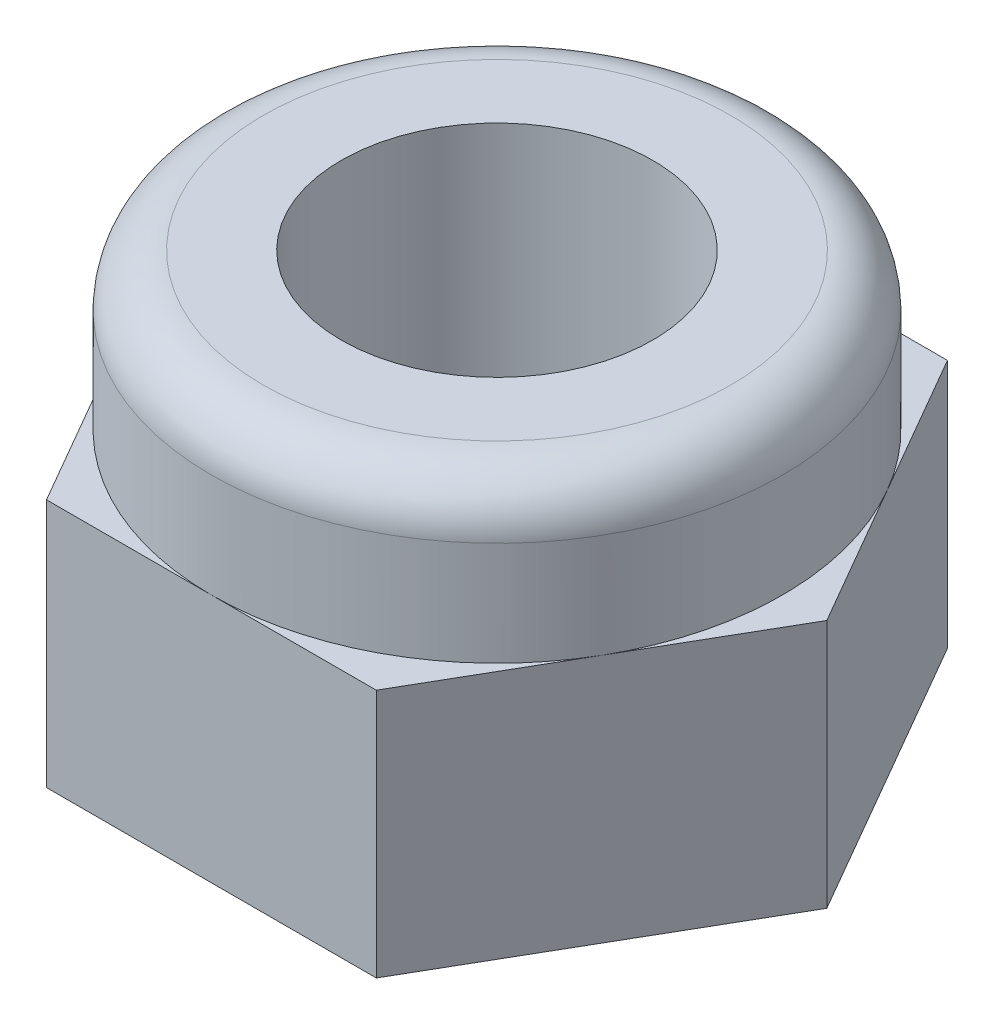
ISO-10303-21;
HEADER;
FILE_DESCRIPTION(('STEP AP214'),'2;1');
FILE_NAME('part.step','',(''),(''),'','','');
FILE_SCHEMA(('AUTOMOTIVE_DESIGN { 1 0 10303 214 1 1 1 1 }'));
ENDSEC;
DATA;
#1=APPLICATION_CONTEXT('core data for automotive mechanical design processes');
#2=APPLICATION_PROTOCOL_DEFINITION('international standard','automotive_design',2000,#1);
#3=PRODUCT_CONTEXT('',#1,'mechanical');
#4=PRODUCT('Part','Part','',(#3));
#5=PRODUCT_RELATED_PRODUCT_CATEGORY('part','',(#4));
#6=PRODUCT_DEFINITION_FORMATION('','',#4);
#7=PRODUCT_DEFINITION_CONTEXT('part definition',#1,'design');
#8=PRODUCT_DEFINITION('design','',#6,#7);
#9=PRODUCT_DEFINITION_SHAPE('','',#8);
#10=(LENGTH_UNIT() NAMED_UNIT(*) SI_UNIT(.MILLI.,.METRE.));
#11=(NAMED_UNIT(*) PLANE_ANGLE_UNIT() SI_UNIT($,.RADIAN.));
#12=(NAMED_UNIT(*) SI_UNIT($,.STERADIAN.) SOLID_ANGLE_UNIT());
#13=UNCERTAINTY_MEASURE_WITH_UNIT(LENGTH_MEASURE(1.E-05),#10,'distance_accuracy_value','');
#14=(GEOMETRIC_REPRESENTATION_CONTEXT(3) GLOBAL_UNCERTAINTY_ASSIGNED_CONTEXT((#13)) GLOBAL_UNIT_ASSIGNED_CONTEXT((#10,
#11,#12)) REPRESENTATION_CONTEXT('',''));
#15=CARTESIAN_POINT('',(0.,0.,0.));
#16=DIRECTION('',(0.,0.,1.));
#17=DIRECTION('',(1.,0.,0.));
#18=AXIS2_PLACEMENT_3D('',#15,#16,#17);
#19=CARTESIAN_POINT('',(0.,2.4,0.));
#20=DIRECTION('',(0.,1.,0.));
#21=DIRECTION('',(0.,0.,1.));
#22=AXIS2_PLACEMENT_3D('',#19,#20,#21);
#23=PLANE('',#22);
#24=CARTESIAN_POINT('',(0.,2.4,0.));
#25=DIRECTION('',(0.,1.,0.));
#26=DIRECTION('',(0.,0.,1.));
#27=AXIS2_PLACEMENT_3D('',#24,#25,#26);
#28=CIRCLE('',#27,2.75);
#29=CARTESIAN_POINT('',(0.,2.4,2.75));
#30=VERTEX_POINT('',#29);
#31=CARTESIAN_POINT('',(2.38156986040721,2.4,1.375));
#32=VERTEX_POINT('',#31);
#33=EDGE_CURVE('E130',#30,#32,#28,.T.);
#34=ORIENTED_EDGE('',*,*,#33,.F.);
#35=DIRECTION('',(1.,0.,0.));
#36=VECTOR('',#35,1.);
#37=CARTESIAN_POINT('',(-1.58771324027147,2.4,2.75));
#38=LINE('',#37,#36);
#39=CARTESIAN_POINT('',(1.58771324027147,2.4,2.75));
#40=VERTEX_POINT('',#39);
#41=EDGE_CURVE('E119',#30,#40,#38,.T.);
#42=ORIENTED_EDGE('',*,*,#41,.T.);
#43=DIRECTION('',(0.5,0.,-0.866025403784439));
#44=VECTOR('',#43,1.);
#45=CARTESIAN_POINT('',(1.58771324027147,2.4,2.75));
#46=LINE('',#45,#44);
#47=EDGE_CURVE('E131',#40,#32,#46,.T.);
#48=ORIENTED_EDGE('',*,*,#47,.T.);
#49=EDGE_LOOP('',(#34,#42,#48));
#50=FACE_BOUND('',#49,.T.);
#51=ADVANCED_FACE('F41',(#50),#23,.T.);
#52=CARTESIAN_POINT('',(2.38156986040721,2.4,-1.375));
#53=VERTEX_POINT('',#52);
#54=EDGE_CURVE('E137',#32,#53,#28,.T.);
#55=ORIENTED_EDGE('',*,*,#54,.F.);
#56=CARTESIAN_POINT('',(3.17542648054294,2.4,0.));
#57=VERTEX_POINT('',#56);
#58=EDGE_CURVE('E151',#32,#57,#46,.T.);
#59=ORIENTED_EDGE('',*,*,#58,.T.);
#60=DIRECTION('',(-0.5,0.,-0.866025403784439));
#61=VECTOR('',#60,1.);
#62=CARTESIAN_POINT('',(3.17542648054294,2.4,0.));
#63=LINE('',#62,#61);
#64=EDGE_CURVE('E152',#57,#53,#63,.T.);
#65=ORIENTED_EDGE('',*,*,#64,.T.);
#66=EDGE_LOOP('',(#55,#59,#65));
#67=FACE_BOUND('',#66,.T.);
#68=ADVANCED_FACE('F232',(#67),#23,.T.);
#69=CARTESIAN_POINT('',(0.,2.4,-2.75));
#70=VERTEX_POINT('',#69);
#71=EDGE_CURVE('E189',#53,#70,#28,.T.);
#72=ORIENTED_EDGE('',*,*,#71,.F.);
#73=CARTESIAN_POINT('',(1.58771324027147,2.4,-2.75));
#74=VERTEX_POINT('',#73);
#75=EDGE_CURVE('E150',#53,#74,#63,.T.);
#76=ORIENTED_EDGE('',*,*,#75,.T.);
#77=DIRECTION('',(-1.,0.,0.));
#78=VECTOR('',#77,1.);
#79=CARTESIAN_POINT('',(1.58771324027147,2.4,-2.75));
#80=LINE('',#79,#78);
#81=EDGE_CURVE('E156',#74,#70,#80,.T.);
#82=ORIENTED_EDGE('',*,*,#81,.T.);
#83=EDGE_LOOP('',(#72,#76,#82));
#84=FACE_BOUND('',#83,.T.);
#85=ADVANCED_FACE('F200',(#84),#23,.T.);
#86=CARTESIAN_POINT('',(-2.38156986040721,2.4,-1.375));
#87=VERTEX_POINT('',#86);
#88=EDGE_CURVE('E141',#70,#87,#28,.T.);
#89=ORIENTED_EDGE('',*,*,#88,.F.);
#90=CARTESIAN_POINT('',(-1.58771324027147,2.4,-2.75));
#91=VERTEX_POINT('',#90);
#92=EDGE_CURVE('E155',#70,#91,#80,.T.);
#93=ORIENTED_EDGE('',*,*,#92,.T.);
#94=DIRECTION('',(-0.5,0.,0.866025403784439));
#95=VECTOR('',#94,1.);
#96=CARTESIAN_POINT('',(-1.58771324027147,2.4,-2.75));
#97=LINE('',#96,#95);
#98=EDGE_CURVE('E160',#91,#87,#97,.T.);
#99=ORIENTED_EDGE('',*,*,#98,.T.);
#100=EDGE_LOOP('',(#89,#93,#99));
#101=FACE_BOUND('',#100,.T.);
#102=ADVANCED_FACE('F193',(#101),#23,.T.);
#103=CARTESIAN_POINT('',(-2.38156986040721,2.4,1.375));
#104=VERTEX_POINT('',#103);
#105=EDGE_CURVE('E64',#87,#104,#28,.T.);
#106=ORIENTED_EDGE('',*,*,#105,.F.);
#107=CARTESIAN_POINT('',(-3.17542648054294,2.4,0.));
#108=VERTEX_POINT('',#107);
#109=EDGE_CURVE('E159',#87,#108,#97,.T.);
#110=ORIENTED_EDGE('',*,*,#109,.T.);
#111=DIRECTION('',(0.5,0.,0.866025403784439));
#112=VECTOR('',#111,1.);
#113=CARTESIAN_POINT('',(-3.17542648054294,2.4,0.));
#114=LINE('',#113,#112);
#115=EDGE_CURVE('E128',#108,#104,#114,.T.);
#116=ORIENTED_EDGE('',*,*,#115,.T.);
#117=EDGE_LOOP('',(#106,#110,#116));
#118=FACE_BOUND('',#117,.T.);
#119=ADVANCED_FACE('F219',(#118),#23,.T.);
#120=CARTESIAN_POINT('',(1.58771324027147,2.4,2.75));
#121=DIRECTION('',(-0.866025403784439,0.,-0.5));
#122=DIRECTION('',(-0.5,0.,0.866025403784439));
#123=AXIS2_PLACEMENT_3D('',#120,#121,#122);
#124=PLANE('',#123);
#125=DIRECTION('',(0.5,0.,-0.866025403784439));
#126=VECTOR('',#125,1.);
#127=CARTESIAN_POINT('',(1.58771324027147,0.,2.75));
#128=LINE('',#127,#126);
#129=CARTESIAN_POINT('',(1.58771324027147,0.,2.75));
#130=VERTEX_POINT('',#129);
#131=CARTESIAN_POINT('',(3.17542648054294,0.,0.));
#132=VERTEX_POINT('',#131);
#133=EDGE_CURVE('E134',#130,#132,#128,.T.);
#134=ORIENTED_EDGE('',*,*,#133,.T.);
#135=DIRECTION('',(0.,-1.,0.));
#136=VECTOR('',#135,1.);
#137=CARTESIAN_POINT('',(3.17542648054294,2.4,0.));
#138=LINE('',#137,#136);
#139=EDGE_CURVE('E140',#57,#132,#138,.T.);
#140=ORIENTED_EDGE('',*,*,#139,.F.);
#141=ORIENTED_EDGE('',*,*,#58,.F.);
#142=ORIENTED_EDGE('',*,*,#47,.F.);
#143=DIRECTION('',(0.,-1.,0.));
#144=VECTOR('',#143,1.);
#145=CARTESIAN_POINT('',(1.58771324027147,2.4,2.75));
#146=LINE('',#145,#144);
#147=EDGE_CURVE('E118',#40,#130,#146,.T.);
#148=ORIENTED_EDGE('',*,*,#147,.T.);
#149=EDGE_LOOP('',(#134,#140,#141,#142,#148));
#150=FACE_BOUND('',#149,.T.);
#151=ADVANCED_FACE('F221',(#150),#124,.F.);
#152=CARTESIAN_POINT('',(3.17542648054294,2.4,0.));
#153=DIRECTION('',(-0.866025403784439,0.,0.5));
#154=DIRECTION('',(0.5,0.,0.866025403784439));
#155=AXIS2_PLACEMENT_3D('',#152,#153,#154);
#156=PLANE('',#155);
#157=DIRECTION('',(-0.5,0.,-0.866025403784439));
#158=VECTOR('',#157,1.);
#159=CARTESIAN_POINT('',(3.17542648054294,0.,0.));
#160=LINE('',#159,#158);
#161=CARTESIAN_POINT('',(1.58771324027147,0.,-2.75));
#162=VERTEX_POINT('',#161);
#163=EDGE_CURVE('E166',#132,#162,#160,.T.);
#164=ORIENTED_EDGE('',*,*,#163,.T.);
#165=DIRECTION('',(0.,-1.,0.));
#166=VECTOR('',#165,1.);
#167=CARTESIAN_POINT('',(1.58771324027147,2.4,-2.75));
#168=LINE('',#167,#166);
#169=EDGE_CURVE('E143',#74,#162,#168,.T.);
#170=ORIENTED_EDGE('',*,*,#169,.F.);
#171=ORIENTED_EDGE('',*,*,#75,.F.);
#172=ORIENTED_EDGE('',*,*,#64,.F.);
#173=ORIENTED_EDGE('',*,*,#139,.T.);
#174=EDGE_LOOP('',(#164,#170,#171,#172,#173));
#175=FACE_BOUND('',#174,.T.);
#176=ADVANCED_FACE('F205',(#175),#156,.F.);
#177=CARTESIAN_POINT('',(1.58771324027147,2.4,-2.75));
#178=DIRECTION('',(0.,0.,1.));
#179=DIRECTION('',(1.,0.,0.));
#180=AXIS2_PLACEMENT_3D('',#177,#178,#179);
#181=PLANE('',#180);
#182=DIRECTION('',(-1.,0.,0.));
#183=VECTOR('',#182,1.);
#184=CARTESIAN_POINT('',(1.58771324027147,0.,-2.75));
#185=LINE('',#184,#183);
#186=CARTESIAN_POINT('',(-1.58771324027147,0.,-2.75));
#187=VERTEX_POINT('',#186);
#188=EDGE_CURVE('E168',#162,#187,#185,.T.);
#189=ORIENTED_EDGE('',*,*,#188,.T.);
#190=DIRECTION('',(0.,-1.,0.));
#191=VECTOR('',#190,1.);
#192=CARTESIAN_POINT('',(-1.58771324027147,2.4,-2.75));
#193=LINE('',#192,#191);
#194=EDGE_CURVE('E182',#91,#187,#193,.T.);
#195=ORIENTED_EDGE('',*,*,#194,.F.);
#196=ORIENTED_EDGE('',*,*,#92,.F.);
#197=ORIENTED_EDGE('',*,*,#81,.F.);
#198=ORIENTED_EDGE('',*,*,#169,.T.);
#199=EDGE_LOOP('',(#189,#195,#196,#197,#198));
#200=FACE_BOUND('',#199,.T.);
#201=ADVANCED_FACE('F198',(#200),#181,.F.);
#202=CARTESIAN_POINT('',(-1.58771324027147,2.4,-2.75));
#203=DIRECTION('',(0.866025403784439,0.,0.5));
#204=DIRECTION('',(0.5,0.,-0.866025403784439));
#205=AXIS2_PLACEMENT_3D('',#202,#203,#204);
#206=PLANE('',#205);
#207=DIRECTION('',(-0.5,0.,0.866025403784439));
#208=VECTOR('',#207,1.);
#209=CARTESIAN_POINT('',(-1.58771324027147,0.,-2.75));
#210=LINE('',#209,#208);
#211=CARTESIAN_POINT('',(-3.17542648054294,0.,0.));
#212=VERTEX_POINT('',#211);
#213=EDGE_CURVE('E170',#187,#212,#210,.T.);
#214=ORIENTED_EDGE('',*,*,#213,.T.);
#215=DIRECTION('',(0.,-1.,0.));
#216=VECTOR('',#215,1.);
#217=CARTESIAN_POINT('',(-3.17542648054294,2.4,0.));
#218=LINE('',#217,#216);
#219=EDGE_CURVE('E179',#108,#212,#218,.T.);
#220=ORIENTED_EDGE('',*,*,#219,.F.);
#221=ORIENTED_EDGE('',*,*,#109,.F.);
#222=ORIENTED_EDGE('',*,*,#98,.F.);
#223=ORIENTED_EDGE('',*,*,#194,.T.);
#224=EDGE_LOOP('',(#214,#220,#221,#222,#223));
#225=FACE_BOUND('',#224,.T.);
#226=ADVANCED_FACE('F215',(#225),#206,.F.);
#227=CARTESIAN_POINT('',(-3.17542648054294,2.4,0.));
#228=DIRECTION('',(0.866025403784439,0.,-0.5));
#229=DIRECTION('',(-0.5,0.,-0.866025403784439));
#230=AXIS2_PLACEMENT_3D('',#227,#228,#229);
#231=PLANE('',#230);
#232=DIRECTION('',(0.5,0.,0.866025403784439));
#233=VECTOR('',#232,1.);
#234=CARTESIAN_POINT('',(-3.17542648054294,0.,0.));
#235=LINE('',#234,#233);
#236=CARTESIAN_POINT('',(-1.58771324027147,0.,2.75));
#237=VERTEX_POINT('',#236);
#238=EDGE_CURVE('E172',#212,#237,#235,.T.);
#239=ORIENTED_EDGE('',*,*,#238,.T.);
#240=DIRECTION('',(0.,-1.,0.));
#241=VECTOR('',#240,1.);
#242=CARTESIAN_POINT('',(-1.58771324027147,2.4,2.75));
#243=LINE('',#242,#241);
#244=CARTESIAN_POINT('',(-1.58771324027147,2.4,2.75));
#245=VERTEX_POINT('',#244);
#246=EDGE_CURVE('E177',#245,#237,#243,.T.);
#247=ORIENTED_EDGE('',*,*,#246,.F.);
#248=EDGE_CURVE('E114',#104,#245,#114,.T.);
#249=ORIENTED_EDGE('',*,*,#248,.F.);
#250=ORIENTED_EDGE('',*,*,#115,.F.);
#251=ORIENTED_EDGE('',*,*,#219,.T.);
#252=EDGE_LOOP('',(#239,#247,#249,#250,#251));
#253=FACE_BOUND('',#252,.T.);
#254=ADVANCED_FACE('F218',(#253),#231,.F.);
#255=CARTESIAN_POINT('',(-1.58771324027147,2.4,2.75));
#256=DIRECTION('',(0.,0.,-1.));
#257=DIRECTION('',(-1.,0.,0.));
#258=AXIS2_PLACEMENT_3D('',#255,#256,#257);
#259=PLANE('',#258);
#260=DIRECTION('',(1.,0.,0.));
#261=VECTOR('',#260,1.);
#262=CARTESIAN_POINT('',(-1.58771324027147,0.,2.75));
#263=LINE('',#262,#261);
#264=EDGE_CURVE('E174',#237,#130,#263,.T.);
#265=ORIENTED_EDGE('',*,*,#264,.T.);
#266=ORIENTED_EDGE('',*,*,#147,.F.);
#267=ORIENTED_EDGE('',*,*,#41,.F.);
#268=EDGE_CURVE('E111',#245,#30,#38,.T.);
#269=ORIENTED_EDGE('',*,*,#268,.F.);
#270=ORIENTED_EDGE('',*,*,#246,.T.);
#271=EDGE_LOOP('',(#265,#266,#267,#269,#270));
#272=FACE_BOUND('',#271,.T.);
#273=ADVANCED_FACE('F123',(#272),#259,.F.);
#274=EDGE_CURVE('E56',#104,#30,#28,.T.);
#275=ORIENTED_EDGE('',*,*,#274,.F.);
#276=ORIENTED_EDGE('',*,*,#248,.T.);
#277=ORIENTED_EDGE('',*,*,#268,.T.);
#278=EDGE_LOOP('',(#275,#276,#277));
#279=FACE_BOUND('',#278,.T.);
#280=ADVANCED_FACE('F113',(#279),#23,.T.);
#281=CARTESIAN_POINT('',(0.,0.,0.));
#282=DIRECTION('',(0.,1.,0.));
#283=DIRECTION('',(0.,0.,1.));
#284=AXIS2_PLACEMENT_3D('',#281,#282,#283);
#285=PLANE('',#284);
#286=CARTESIAN_POINT('',(0.,0.,0.));
#287=DIRECTION('',(0.,1.,0.));
#288=DIRECTION('',(0.,0.,1.));
#289=AXIS2_PLACEMENT_3D('',#286,#287,#288);
#290=CIRCLE('',#289,1.5);
#291=CARTESIAN_POINT('',(0.,0.,1.5));
#292=VERTEX_POINT('',#291);
#293=EDGE_CURVE('E135',#292,#292,#290,.T.);
#294=ORIENTED_EDGE('',*,*,#293,.T.);
#295=EDGE_LOOP('',(#294));
#296=FACE_BOUND('',#295,.T.);
#297=ORIENTED_EDGE('',*,*,#133,.F.);
#298=ORIENTED_EDGE('',*,*,#264,.F.);
#299=ORIENTED_EDGE('',*,*,#238,.F.);
#300=ORIENTED_EDGE('',*,*,#213,.F.);
#301=ORIENTED_EDGE('',*,*,#188,.F.);
#302=ORIENTED_EDGE('',*,*,#163,.F.);
#303=EDGE_LOOP('',(#297,#298,#299,#300,#301,#302));
#304=FACE_BOUND('',#303,.T.);
#305=ADVANCED_FACE('F210',(#296,#304),#285,.F.);
#306=CARTESIAN_POINT('',(0.,15.578174593052,0.));
#307=DIRECTION('',(0.,-1.,0.));
#308=DIRECTION('',(0.,0.,-1.));
#309=AXIS2_PLACEMENT_3D('',#306,#307,#308);
#310=CYLINDRICAL_SURFACE('',#309,2.75);
#311=CARTESIAN_POINT('',(0.,3.4,0.));
#312=DIRECTION('',(0.,1.,0.));
#313=DIRECTION('',(0.,0.,1.));
#314=AXIS2_PLACEMENT_3D('',#311,#312,#313);
#315=CIRCLE('',#314,2.75);
#316=CARTESIAN_POINT('',(0.,3.4,2.75));
#317=VERTEX_POINT('',#316);
#318=EDGE_CURVE('E12',#317,#317,#315,.F.);
#319=ORIENTED_EDGE('',*,*,#318,.T.);
#320=EDGE_LOOP('',(#319));
#321=FACE_BOUND('',#320,.T.);
#322=ORIENTED_EDGE('',*,*,#33,.T.);
#323=ORIENTED_EDGE('',*,*,#54,.T.);
#324=ORIENTED_EDGE('',*,*,#71,.T.);
#325=ORIENTED_EDGE('',*,*,#88,.T.);
#326=ORIENTED_EDGE('',*,*,#105,.T.);
#327=ORIENTED_EDGE('',*,*,#274,.T.);
#328=EDGE_LOOP('',(#322,#323,#324,#325,#326,#327));
#329=FACE_BOUND('',#328,.T.);
#330=ADVANCED_FACE('F138',(#321,#329),#310,.T.);
#331=CARTESIAN_POINT('',(0.,3.9,0.));
#332=DIRECTION('',(0.,1.,0.));
#333=DIRECTION('',(0.,0.,1.));
#334=AXIS2_PLACEMENT_3D('',#331,#332,#333);
#335=PLANE('',#334);
#336=CARTESIAN_POINT('',(0.,3.9,0.));
#337=DIRECTION('',(0.,1.,0.));
#338=DIRECTION('',(0.,0.,1.));
#339=AXIS2_PLACEMENT_3D('',#336,#337,#338);
#340=CIRCLE('',#339,2.25);
#341=CARTESIAN_POINT('',(0.,3.9,2.25));
#342=VERTEX_POINT('',#341);
#343=EDGE_CURVE('E49',#342,#342,#340,.T.);
#344=ORIENTED_EDGE('',*,*,#343,.T.);
#345=EDGE_LOOP('',(#344));
#346=FACE_BOUND('',#345,.T.);
#347=CARTESIAN_POINT('',(0.,3.9,0.));
#348=DIRECTION('',(0.,1.,0.));
#349=DIRECTION('',(0.,0.,1.));
#350=AXIS2_PLACEMENT_3D('',#347,#348,#349);
#351=CIRCLE('',#350,1.5);
#352=CARTESIAN_POINT('',(0.,3.9,1.5));
#353=VERTEX_POINT('',#352);
#354=EDGE_CURVE('E147',#353,#353,#351,.T.);
#355=ORIENTED_EDGE('',*,*,#354,.F.);
#356=EDGE_LOOP('',(#355));
#357=FACE_BOUND('',#356,.T.);
#358=ADVANCED_FACE('F301',(#346,#357),#335,.T.);
#359=CARTESIAN_POINT('',(0.,0.,0.));
#360=DIRECTION('',(0.,1.,0.));
#361=DIRECTION('',(0.,0.,1.));
#362=AXIS2_PLACEMENT_3D('',#359,#360,#361);
#363=CYLINDRICAL_SURFACE('',#362,1.5);
#364=ORIENTED_EDGE('',*,*,#293,.F.);
#365=EDGE_LOOP('',(#364));
#366=FACE_BOUND('',#365,.T.);
#367=ORIENTED_EDGE('',*,*,#354,.T.);
#368=EDGE_LOOP('',(#367));
#369=FACE_BOUND('',#368,.T.);
#370=ADVANCED_FACE('F297',(#366,#369),#363,.F.);
#371=CARTESIAN_POINT('',(0.,3.4,0.));
#372=DIRECTION('',(0.,1.,0.));
#373=DIRECTION('',(0.,0.,1.));
#374=AXIS2_PLACEMENT_3D('',#371,#372,#373);
#375=TOROIDAL_SURFACE('',#374,2.25,0.5);
#376=ORIENTED_EDGE('',*,*,#318,.F.);
#377=EDGE_LOOP('',(#376));
#378=FACE_BOUND('',#377,.T.);
#379=ORIENTED_EDGE('',*,*,#343,.F.);
#380=EDGE_LOOP('',(#379));
#381=FACE_BOUND('',#380,.T.);
#382=ADVANCED_FACE('F43',(#378,#381),#375,.T.);
#383=CLOSED_SHELL('',(#51,#68,#85,#102,#119,#151,#176,#201,#226,#254,#273,#280,#305,#330,#358,
#370,#382));
#384=MANIFOLD_SOLID_BREP('B2',#383);
#385=ADVANCED_BREP_SHAPE_REPRESENTATION('',(#18,#384),#14);
#386=SHAPE_DEFINITION_REPRESENTATION(#9,#385);
ENDSEC;
END-ISO-10303-21;
